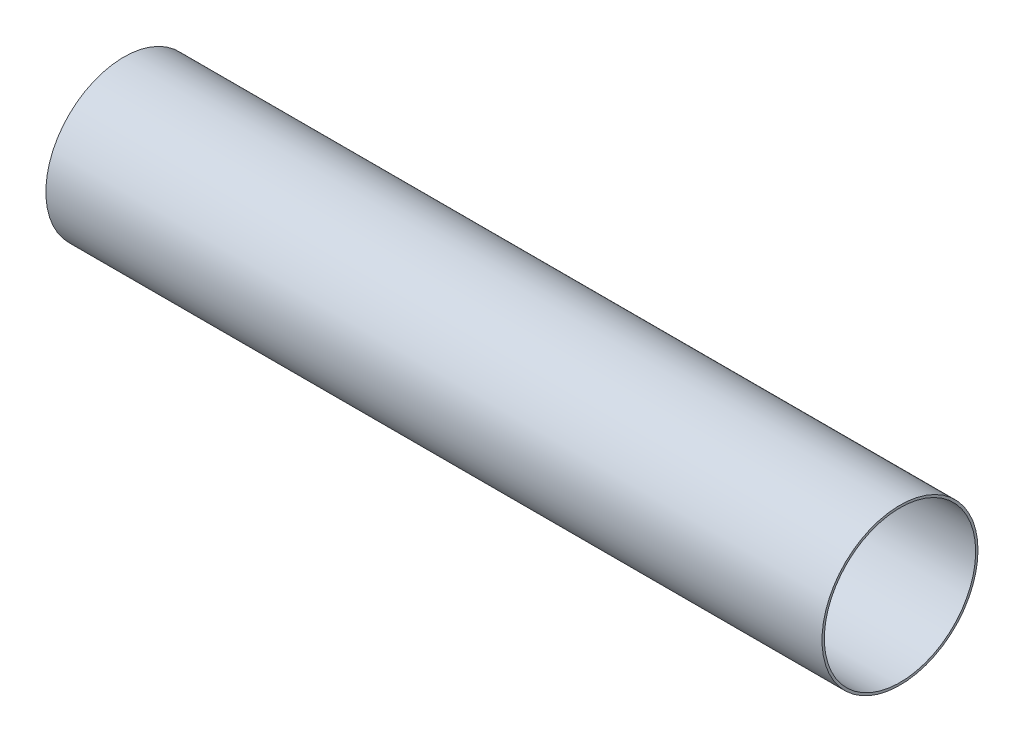
ISO-10303-21;
HEADER;
FILE_DESCRIPTION(('STEP AP214'),'2;1');
FILE_NAME('part.step','',(''),(''),'','','');
FILE_SCHEMA(('AUTOMOTIVE_DESIGN { 1 0 10303 214 1 1 1 1 }'));
ENDSEC;
DATA;
#1=APPLICATION_CONTEXT('core data for automotive mechanical design processes');
#2=APPLICATION_PROTOCOL_DEFINITION('international standard','automotive_design',2000,#1);
#3=PRODUCT_CONTEXT('',#1,'mechanical');
#4=PRODUCT('Part','Part','',(#3));
#5=PRODUCT_RELATED_PRODUCT_CATEGORY('part','',(#4));
#6=PRODUCT_DEFINITION_FORMATION('','',#4);
#7=PRODUCT_DEFINITION_CONTEXT('part definition',#1,'design');
#8=PRODUCT_DEFINITION('design','',#6,#7);
#9=PRODUCT_DEFINITION_SHAPE('','',#8);
#10=(LENGTH_UNIT() NAMED_UNIT(*) SI_UNIT(.MILLI.,.METRE.));
#11=(NAMED_UNIT(*) PLANE_ANGLE_UNIT() SI_UNIT($,.RADIAN.));
#12=(NAMED_UNIT(*) SI_UNIT($,.STERADIAN.) SOLID_ANGLE_UNIT());
#13=UNCERTAINTY_MEASURE_WITH_UNIT(LENGTH_MEASURE(1.E-05),#10,'distance_accuracy_value','');
#14=(GEOMETRIC_REPRESENTATION_CONTEXT(3) GLOBAL_UNCERTAINTY_ASSIGNED_CONTEXT((#13)) GLOBAL_UNIT_ASSIGNED_CONTEXT((#10,
#11,#12)) REPRESENTATION_CONTEXT('',''));
#15=CARTESIAN_POINT('',(0.,0.,0.));
#16=DIRECTION('',(0.,0.,1.));
#17=DIRECTION('',(1.,0.,0.));
#18=AXIS2_PLACEMENT_3D('',#15,#16,#17);
#19=CARTESIAN_POINT('',(508.,0.,0.));
#20=DIRECTION('',(1.,0.,0.));
#21=DIRECTION('',(0.,0.,-1.));
#22=AXIS2_PLACEMENT_3D('',#19,#20,#21);
#23=PLANE('',#22);
#24=CARTESIAN_POINT('',(508.,0.,0.));
#25=DIRECTION('',(1.,0.,0.));
#26=DIRECTION('',(0.,0.,-1.));
#27=AXIS2_PLACEMENT_3D('',#24,#25,#26);
#28=CIRCLE('',#27,51.054);
#29=CARTESIAN_POINT('',(508.,0.,-51.054));
#30=VERTEX_POINT('',#29);
#31=EDGE_CURVE('E10',#30,#30,#28,.T.);
#32=ORIENTED_EDGE('',*,*,#31,.T.);
#33=EDGE_LOOP('',(#32));
#34=FACE_BOUND('',#33,.T.);
#35=CARTESIAN_POINT('',(508.,0.,0.));
#36=DIRECTION('',(1.,0.,0.));
#37=DIRECTION('',(0.,0.,-1.));
#38=AXIS2_PLACEMENT_3D('',#35,#36,#37);
#39=CIRCLE('',#38,49.53);
#40=CARTESIAN_POINT('',(508.,0.,-49.53));
#41=VERTEX_POINT('',#40);
#42=EDGE_CURVE('E56',#41,#41,#39,.T.);
#43=ORIENTED_EDGE('',*,*,#42,.F.);
#44=EDGE_LOOP('',(#43));
#45=FACE_BOUND('',#44,.T.);
#46=ADVANCED_FACE('F43',(#34,#45),#23,.T.);
#47=CARTESIAN_POINT('',(0.,0.,0.));
#48=DIRECTION('',(1.,0.,0.));
#49=DIRECTION('',(0.,0.,-1.));
#50=AXIS2_PLACEMENT_3D('',#47,#48,#49);
#51=PLANE('',#50);
#52=CARTESIAN_POINT('',(0.,0.,0.));
#53=DIRECTION('',(1.,0.,0.));
#54=DIRECTION('',(0.,0.,-1.));
#55=AXIS2_PLACEMENT_3D('',#52,#53,#54);
#56=CIRCLE('',#55,51.054);
#57=CARTESIAN_POINT('',(0.,0.,-51.054));
#58=VERTEX_POINT('',#57);
#59=EDGE_CURVE('E47',#58,#58,#56,.T.);
#60=ORIENTED_EDGE('',*,*,#59,.F.);
#61=EDGE_LOOP('',(#60));
#62=FACE_BOUND('',#61,.T.);
#63=CARTESIAN_POINT('',(0.,0.,0.));
#64=DIRECTION('',(1.,0.,0.));
#65=DIRECTION('',(0.,0.,-1.));
#66=AXIS2_PLACEMENT_3D('',#63,#64,#65);
#67=CIRCLE('',#66,49.53);
#68=CARTESIAN_POINT('',(0.,0.,-49.53));
#69=VERTEX_POINT('',#68);
#70=EDGE_CURVE('E58',#69,#69,#67,.T.);
#71=ORIENTED_EDGE('',*,*,#70,.T.);
#72=EDGE_LOOP('',(#71));
#73=FACE_BOUND('',#72,.T.);
#74=ADVANCED_FACE('F70',(#62,#73),#51,.F.);
#75=CARTESIAN_POINT('',(508.,0.,0.));
#76=DIRECTION('',(-1.,0.,0.));
#77=DIRECTION('',(0.,0.,1.));
#78=AXIS2_PLACEMENT_3D('',#75,#76,#77);
#79=CYLINDRICAL_SURFACE('',#78,51.054);
#80=ORIENTED_EDGE('',*,*,#31,.F.);
#81=EDGE_LOOP('',(#80));
#82=FACE_BOUND('',#81,.T.);
#83=ORIENTED_EDGE('',*,*,#59,.T.);
#84=EDGE_LOOP('',(#83));
#85=FACE_BOUND('',#84,.T.);
#86=ADVANCED_FACE('F45',(#82,#85),#79,.T.);
#87=CARTESIAN_POINT('',(508.,0.,0.));
#88=DIRECTION('',(-1.,0.,0.));
#89=DIRECTION('',(0.,0.,1.));
#90=AXIS2_PLACEMENT_3D('',#87,#88,#89);
#91=CYLINDRICAL_SURFACE('',#90,49.53);
#92=ORIENTED_EDGE('',*,*,#42,.T.);
#93=EDGE_LOOP('',(#92));
#94=FACE_BOUND('',#93,.T.);
#95=ORIENTED_EDGE('',*,*,#70,.F.);
#96=EDGE_LOOP('',(#95));
#97=FACE_BOUND('',#96,.T.);
#98=ADVANCED_FACE('F66',(#94,#97),#91,.F.);
#99=CLOSED_SHELL('',(#46,#74,#86,#98));
#100=MANIFOLD_SOLID_BREP('B2',#99);
#101=ADVANCED_BREP_SHAPE_REPRESENTATION('',(#18,#100),#14);
#102=SHAPE_DEFINITION_REPRESENTATION(#9,#101);
ENDSEC;
END-ISO-10303-21;
